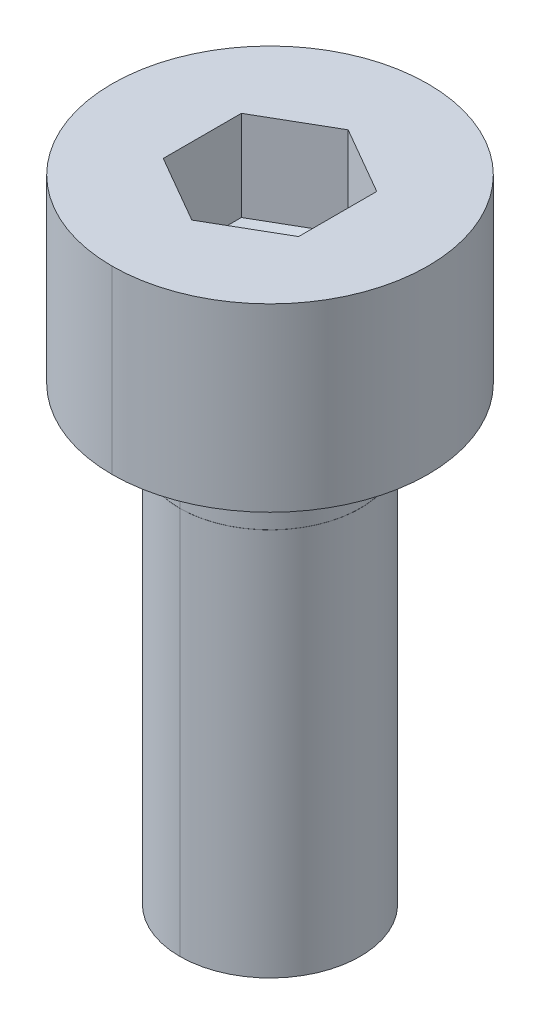
ISO-10303-21;
HEADER;
FILE_DESCRIPTION(('STEP AP214'),'2;1');
FILE_NAME('part.step','',(''),(''),'','','');
FILE_SCHEMA(('AUTOMOTIVE_DESIGN { 1 0 10303 214 1 1 1 1 }'));
ENDSEC;
DATA;
#1=APPLICATION_CONTEXT('core data for automotive mechanical design processes');
#2=APPLICATION_PROTOCOL_DEFINITION('international standard','automotive_design',2000,#1);
#3=PRODUCT_CONTEXT('',#1,'mechanical');
#4=PRODUCT('Part','Part','',(#3));
#5=PRODUCT_RELATED_PRODUCT_CATEGORY('part','',(#4));
#6=PRODUCT_DEFINITION_FORMATION('','',#4);
#7=PRODUCT_DEFINITION_CONTEXT('part definition',#1,'design');
#8=PRODUCT_DEFINITION('design','',#6,#7);
#9=PRODUCT_DEFINITION_SHAPE('','',#8);
#10=(LENGTH_UNIT() NAMED_UNIT(*) SI_UNIT(.MILLI.,.METRE.));
#11=(NAMED_UNIT(*) PLANE_ANGLE_UNIT() SI_UNIT($,.RADIAN.));
#12=(NAMED_UNIT(*) SI_UNIT($,.STERADIAN.) SOLID_ANGLE_UNIT());
#13=UNCERTAINTY_MEASURE_WITH_UNIT(LENGTH_MEASURE(1.E-05),#10,'distance_accuracy_value','');
#14=(GEOMETRIC_REPRESENTATION_CONTEXT(3) GLOBAL_UNCERTAINTY_ASSIGNED_CONTEXT((#13)) GLOBAL_UNIT_ASSIGNED_CONTEXT((#10,
#11,#12)) REPRESENTATION_CONTEXT('',''));
#15=CARTESIAN_POINT('',(0.,0.,0.));
#16=DIRECTION('',(0.,0.,1.));
#17=DIRECTION('',(1.,0.,0.));
#18=AXIS2_PLACEMENT_3D('',#15,#16,#17);
#19=CARTESIAN_POINT('',(-21.75,1133.5,-4.99289208382735E-13));
#20=DIRECTION('',(0.,1.,0.));
#21=DIRECTION('',(0.,0.,-1.));
#22=AXIS2_PLACEMENT_3D('',#19,#20,#21);
#23=CONICAL_SURFACE('',#22,1732.05080756888,1.0471975511966);
#24=DIRECTION('',(0.,0.5,-0.866025403784439));
#25=VECTOR('',#24,1.);
#26=CARTESIAN_POINT('',(-21.75,133.499999999999,-1.1643233849004E-13));
#27=LINE('',#26,#25);
#28=CARTESIAN_POINT('',(-21.75,133.499999999999,-1.1643233849004E-13));
#29=VERTEX_POINT('',#28);
#30=CARTESIAN_POINT('',(-21.75,134.499999999999,-1.732050807569));
#31=VERTEX_POINT('',#30);
#32=EDGE_CURVE('E191',#29,#31,#27,.T.);
#33=ORIENTED_EDGE('',*,*,#32,.F.);
#34=DIRECTION('',(0.,0.5,0.866025403784439));
#35=VECTOR('',#34,1.);
#36=CARTESIAN_POINT('',(-21.75,133.499999999999,-1.1643233849004E-13));
#37=LINE('',#36,#35);
#38=CARTESIAN_POINT('',(-21.75,134.499999999999,1.73205080756877));
#39=VERTEX_POINT('',#38);
#40=EDGE_CURVE('E183',#29,#39,#37,.T.);
#41=ORIENTED_EDGE('',*,*,#40,.T.);
#42=CARTESIAN_POINT('',(-21.75,134.499999999999,-1.1687642769989E-13));
#43=DIRECTION('',(0.,1.,0.));
#44=DIRECTION('',(0.,0.,1.));
#45=AXIS2_PLACEMENT_3D('',#42,#43,#44);
#46=CIRCLE('',#45,1.73205080756888);
#47=CARTESIAN_POINT('',(-20.25,134.499999999999,0.866025403784325));
#48=VERTEX_POINT('',#47);
#49=EDGE_CURVE('E156',#39,#48,#46,.T.);
#50=ORIENTED_EDGE('',*,*,#49,.T.);
#51=CARTESIAN_POINT('',(-21.75,134.499999999999,-1.1687642769989E-13));
#52=DIRECTION('',(0.,1.,0.));
#53=DIRECTION('',(0.,0.,1.));
#54=AXIS2_PLACEMENT_3D('',#51,#52,#53);
#55=CIRCLE('',#54,1.73205080756888);
#56=CARTESIAN_POINT('',(-20.25,134.499999999999,-0.866025403784554));
#57=VERTEX_POINT('',#56);
#58=EDGE_CURVE('E218',#48,#57,#55,.T.);
#59=ORIENTED_EDGE('',*,*,#58,.T.);
#60=CARTESIAN_POINT('',(-21.75,134.499999999999,-1.1687642769989E-13));
#61=DIRECTION('',(0.,1.,0.));
#62=DIRECTION('',(0.,0.,1.));
#63=AXIS2_PLACEMENT_3D('',#60,#61,#62);
#64=CIRCLE('',#63,1.73205080756888);
#65=EDGE_CURVE('E235',#57,#31,#64,.T.);
#66=ORIENTED_EDGE('',*,*,#65,.T.);
#67=EDGE_LOOP('',(#33,#41,#50,#59,#66));
#68=FACE_BOUND('',#67,.T.);
#69=ADVANCED_FACE('F17',(#68),#23,.F.);
#70=CARTESIAN_POINT('',(-21.75,132.499999999999,-1.1598824928019E-13));
#71=DIRECTION('',(0.,-1.,0.));
#72=DIRECTION('',(0.,0.,1.));
#73=AXIS2_PLACEMENT_3D('',#70,#71,#72);
#74=CYLINDRICAL_SURFACE('',#73,3.49999999999984);
#75=CARTESIAN_POINT('',(-21.75,136.499999999999,-1.1776460611959E-13));
#76=DIRECTION('',(0.,1.,0.));
#77=DIRECTION('',(0.,0.,1.));
#78=AXIS2_PLACEMENT_3D('',#75,#76,#77);
#79=CIRCLE('',#78,3.49999999999984);
#80=CARTESIAN_POINT('',(-21.75,136.499999999999,-3.49999999999996));
#81=VERTEX_POINT('',#80);
#82=CARTESIAN_POINT('',(-21.75,136.499999999999,3.49999999999972));
#83=VERTEX_POINT('',#82);
#84=EDGE_CURVE('E11',#81,#83,#79,.T.);
#85=ORIENTED_EDGE('',*,*,#84,.F.);
#86=DIRECTION('',(0.,-1.,0.));
#87=VECTOR('',#86,1.);
#88=CARTESIAN_POINT('',(-21.75,132.499999999999,-3.49999999999995));
#89=LINE('',#88,#87);
#90=CARTESIAN_POINT('',(-21.75,132.499999999999,-3.49999999999995));
#91=VERTEX_POINT('',#90);
#92=EDGE_CURVE('E230',#81,#91,#89,.T.);
#93=ORIENTED_EDGE('',*,*,#92,.T.);
#94=CARTESIAN_POINT('',(-21.75,132.499999999999,-1.1598824928019E-13));
#95=DIRECTION('',(0.,1.,0.));
#96=DIRECTION('',(0.,0.,1.));
#97=AXIS2_PLACEMENT_3D('',#94,#95,#96);
#98=CIRCLE('',#97,3.49999999999984);
#99=CARTESIAN_POINT('',(-21.75,132.499999999999,3.49999999999972));
#100=VERTEX_POINT('',#99);
#101=EDGE_CURVE('E286',#91,#100,#98,.T.);
#102=ORIENTED_EDGE('',*,*,#101,.T.);
#103=DIRECTION('',(0.,-1.,0.));
#104=VECTOR('',#103,1.);
#105=CARTESIAN_POINT('',(-21.75,132.499999999999,3.49999999999972));
#106=LINE('',#105,#104);
#107=EDGE_CURVE('E278',#83,#100,#106,.T.);
#108=ORIENTED_EDGE('',*,*,#107,.F.);
#109=EDGE_LOOP('',(#85,#93,#102,#108));
#110=FACE_BOUND('',#109,.T.);
#111=ADVANCED_FACE('F553',(#110),#74,.T.);
#112=CARTESIAN_POINT('',(-21.75,132.499999999999,-1.1598824928019E-13));
#113=DIRECTION('',(0.,-1.,0.));
#114=DIRECTION('',(0.,0.,1.));
#115=AXIS2_PLACEMENT_3D('',#112,#113,#114);
#116=CYLINDRICAL_SURFACE('',#115,1.99749999999988);
#117=CARTESIAN_POINT('',(-21.75,132.499999999999,-1.1598824928019E-13));
#118=DIRECTION('',(0.,1.,0.));
#119=DIRECTION('',(0.,0.,1.));
#120=AXIS2_PLACEMENT_3D('',#117,#118,#119);
#121=CIRCLE('',#120,1.99749999999988);
#122=CARTESIAN_POINT('',(-21.75,132.499999999999,-1.9975));
#123=VERTEX_POINT('',#122);
#124=CARTESIAN_POINT('',(-21.75,132.499999999999,1.99749999999976));
#125=VERTEX_POINT('',#124);
#126=EDGE_CURVE('E293',#123,#125,#121,.T.);
#127=ORIENTED_EDGE('',*,*,#126,.F.);
#128=DIRECTION('',(0.,-1.,0.));
#129=VECTOR('',#128,1.);
#130=CARTESIAN_POINT('',(-21.75,132.499999999999,-1.9975));
#131=LINE('',#130,#129);
#132=CARTESIAN_POINT('',(-21.75,131.099999999999,-1.9975));
#133=VERTEX_POINT('',#132);
#134=EDGE_CURVE('E249',#123,#133,#131,.T.);
#135=ORIENTED_EDGE('',*,*,#134,.T.);
#136=CARTESIAN_POINT('',(-21.75,131.099999999999,-1.153665243864E-13));
#137=DIRECTION('',(0.,1.,0.));
#138=DIRECTION('',(0.,0.,1.));
#139=AXIS2_PLACEMENT_3D('',#136,#137,#138);
#140=CIRCLE('',#139,1.99749999999988);
#141=CARTESIAN_POINT('',(-21.75,131.099999999999,1.99749999999976));
#142=VERTEX_POINT('',#141);
#143=EDGE_CURVE('E261',#133,#142,#140,.T.);
#144=ORIENTED_EDGE('',*,*,#143,.T.);
#145=DIRECTION('',(0.,-1.,0.));
#146=VECTOR('',#145,1.);
#147=CARTESIAN_POINT('',(-21.75,132.499999999999,1.99749999999976));
#148=LINE('',#147,#146);
#149=EDGE_CURVE('E245',#125,#142,#148,.T.);
#150=ORIENTED_EDGE('',*,*,#149,.F.);
#151=EDGE_LOOP('',(#127,#135,#144,#150));
#152=FACE_BOUND('',#151,.T.);
#153=ADVANCED_FACE('F543',(#152),#116,.T.);
#154=CARTESIAN_POINT('',(-21.75,132.499999999999,-1.1598824928019E-13));
#155=DIRECTION('',(0.,-1.,0.));
#156=DIRECTION('',(0.,0.,1.));
#157=AXIS2_PLACEMENT_3D('',#154,#155,#156);
#158=CYLINDRICAL_SURFACE('',#157,1.99999999999978);
#159=CARTESIAN_POINT('',(-21.75,131.099999999999,-1.153665243864E-13));
#160=DIRECTION('',(0.,1.,0.));
#161=DIRECTION('',(0.,0.,1.));
#162=AXIS2_PLACEMENT_3D('',#159,#160,#161);
#163=CIRCLE('',#162,1.99999999999978);
#164=CARTESIAN_POINT('',(-21.75,131.099999999999,-1.9999999999999));
#165=VERTEX_POINT('',#164);
#166=CARTESIAN_POINT('',(-21.75,131.099999999999,1.99999999999967));
#167=VERTEX_POINT('',#166);
#168=EDGE_CURVE('E222',#165,#167,#163,.T.);
#169=ORIENTED_EDGE('',*,*,#168,.F.);
#170=DIRECTION('',(0.,-1.,0.));
#171=VECTOR('',#170,1.);
#172=CARTESIAN_POINT('',(-21.75,132.499999999999,-1.9999999999999));
#173=LINE('',#172,#171);
#174=CARTESIAN_POINT('',(-21.75,122.499999999999,-1.99999999999989));
#175=VERTEX_POINT('',#174);
#176=EDGE_CURVE('E264',#165,#175,#173,.T.);
#177=ORIENTED_EDGE('',*,*,#176,.T.);
#178=CARTESIAN_POINT('',(-21.75,122.499999999999,-1.11547357181689E-13));
#179=DIRECTION('',(0.,1.,0.));
#180=DIRECTION('',(0.,0.,1.));
#181=AXIS2_PLACEMENT_3D('',#178,#179,#180);
#182=CIRCLE('',#181,1.99999999999978);
#183=CARTESIAN_POINT('',(-21.75,122.499999999999,1.99999999999967));
#184=VERTEX_POINT('',#183);
#185=EDGE_CURVE('E25',#175,#184,#182,.T.);
#186=ORIENTED_EDGE('',*,*,#185,.T.);
#187=DIRECTION('',(0.,-1.,0.));
#188=VECTOR('',#187,1.);
#189=CARTESIAN_POINT('',(-21.75,132.499999999999,1.99999999999967));
#190=LINE('',#189,#188);
#191=EDGE_CURVE('E308',#167,#184,#190,.T.);
#192=ORIENTED_EDGE('',*,*,#191,.F.);
#193=EDGE_LOOP('',(#169,#177,#186,#192));
#194=FACE_BOUND('',#193,.T.);
#195=ADVANCED_FACE('F532',(#194),#158,.T.);
#196=CARTESIAN_POINT('',(-18.25,136.499999999999,-1.17449378820726E-13));
#197=DIRECTION('',(0.,1.,0.));
#198=DIRECTION('',(0.,0.,-1.));
#199=AXIS2_PLACEMENT_3D('',#196,#197,#198);
#200=PLANE('',#199);
#201=DIRECTION('',(-0.866025403784439,0.,-0.5));
#202=VECTOR('',#201,1.);
#203=CARTESIAN_POINT('',(-21.75,136.499999999999,1.73205080756876));
#204=LINE('',#203,#202);
#205=CARTESIAN_POINT('',(-21.75,136.499999999999,1.73205080756876));
#206=VERTEX_POINT('',#205);
#207=CARTESIAN_POINT('',(-23.25,136.499999999999,0.86602540378432));
#208=VERTEX_POINT('',#207);
#209=EDGE_CURVE('E147',#206,#208,#204,.T.);
#210=ORIENTED_EDGE('',*,*,#209,.T.);
#211=DIRECTION('',(0.,0.,-1.));
#212=VECTOR('',#211,1.);
#213=CARTESIAN_POINT('',(-23.25,136.499999999999,0.86602540378432));
#214=LINE('',#213,#212);
#215=CARTESIAN_POINT('',(-23.25,136.499999999999,-0.866025403784556));
#216=VERTEX_POINT('',#215);
#217=EDGE_CURVE('E267',#208,#216,#214,.T.);
#218=ORIENTED_EDGE('',*,*,#217,.T.);
#219=DIRECTION('',(0.866025403784439,0.,-0.5));
#220=VECTOR('',#219,1.);
#221=CARTESIAN_POINT('',(-23.25,136.499999999999,-0.866025403784556));
#222=LINE('',#221,#220);
#223=CARTESIAN_POINT('',(-21.75,136.499999999999,-1.73205080756899));
#224=VERTEX_POINT('',#223);
#225=EDGE_CURVE('E257',#216,#224,#222,.T.);
#226=ORIENTED_EDGE('',*,*,#225,.T.);
#227=DIRECTION('',(0.866025403784439,0.,0.5));
#228=VECTOR('',#227,1.);
#229=CARTESIAN_POINT('',(-21.75,136.499999999999,-1.73205080756899));
#230=LINE('',#229,#228);
#231=CARTESIAN_POINT('',(-20.25,136.499999999999,-0.866025403784555));
#232=VERTEX_POINT('',#231);
#233=EDGE_CURVE('E203',#224,#232,#230,.T.);
#234=ORIENTED_EDGE('',*,*,#233,.T.);
#235=DIRECTION('',(0.,0.,1.));
#236=VECTOR('',#235,1.);
#237=CARTESIAN_POINT('',(-20.25,136.499999999999,-0.866025403784555));
#238=LINE('',#237,#236);
#239=CARTESIAN_POINT('',(-20.25,136.499999999999,0.86602540378432));
#240=VERTEX_POINT('',#239);
#241=EDGE_CURVE('E207',#232,#240,#238,.T.);
#242=ORIENTED_EDGE('',*,*,#241,.T.);
#243=DIRECTION('',(-0.866025403784439,0.,0.5));
#244=VECTOR('',#243,1.);
#245=CARTESIAN_POINT('',(-20.25,136.499999999999,0.86602540378432));
#246=LINE('',#245,#244);
#247=EDGE_CURVE('E151',#240,#206,#246,.T.);
#248=ORIENTED_EDGE('',*,*,#247,.T.);
#249=EDGE_LOOP('',(#210,#218,#226,#234,#242,#248));
#250=FACE_BOUND('',#249,.T.);
#251=CARTESIAN_POINT('',(-21.75,136.499999999999,-1.1776460611959E-13));
#252=DIRECTION('',(0.,1.,0.));
#253=DIRECTION('',(0.,0.,1.));
#254=AXIS2_PLACEMENT_3D('',#251,#252,#253);
#255=CIRCLE('',#254,3.49999999999984);
#256=EDGE_CURVE('E234',#83,#81,#255,.T.);
#257=ORIENTED_EDGE('',*,*,#256,.T.);
#258=ORIENTED_EDGE('',*,*,#84,.T.);
#259=EDGE_LOOP('',(#257,#258));
#260=FACE_BOUND('',#259,.T.);
#261=ADVANCED_FACE('F522',(#250,#260),#200,.T.);
#262=CARTESIAN_POINT('',(-21.75,122.499999999999,-1.11547357181689E-13));
#263=DIRECTION('',(0.,-1.,0.));
#264=DIRECTION('',(-1.,0.,0.));
#265=AXIS2_PLACEMENT_3D('',#262,#263,#264);
#266=PLANE('',#265);
#267=CARTESIAN_POINT('',(-21.75,122.499999999999,-1.11547357181689E-13));
#268=DIRECTION('',(0.,1.,0.));
#269=DIRECTION('',(0.,0.,1.));
#270=AXIS2_PLACEMENT_3D('',#267,#268,#269);
#271=CIRCLE('',#270,1.99999999999978);
#272=EDGE_CURVE('E312',#184,#175,#271,.T.);
#273=ORIENTED_EDGE('',*,*,#272,.F.);
#274=ORIENTED_EDGE('',*,*,#185,.F.);
#275=EDGE_LOOP('',(#273,#274));
#276=FACE_BOUND('',#275,.T.);
#277=ADVANCED_FACE('F511',(#276),#266,.T.);
#278=CARTESIAN_POINT('',(-21.75,132.499999999999,-1.1598824928019E-13));
#279=DIRECTION('',(0.,-1.,0.));
#280=DIRECTION('',(0.,0.,1.));
#281=AXIS2_PLACEMENT_3D('',#278,#279,#280);
#282=CYLINDRICAL_SURFACE('',#281,1.99999999999978);
#283=ORIENTED_EDGE('',*,*,#176,.F.);
#284=CARTESIAN_POINT('',(-21.75,131.099999999999,-1.153665243864E-13));
#285=DIRECTION('',(0.,1.,0.));
#286=DIRECTION('',(0.,0.,1.));
#287=AXIS2_PLACEMENT_3D('',#284,#285,#286);
#288=CIRCLE('',#287,1.99999999999978);
#289=EDGE_CURVE('E219',#167,#165,#288,.T.);
#290=ORIENTED_EDGE('',*,*,#289,.F.);
#291=ORIENTED_EDGE('',*,*,#191,.T.);
#292=ORIENTED_EDGE('',*,*,#272,.T.);
#293=EDGE_LOOP('',(#283,#290,#291,#292));
#294=FACE_BOUND('',#293,.T.);
#295=ADVANCED_FACE('F500',(#294),#282,.T.);
#296=CARTESIAN_POINT('',(-19.7500000000003,131.099999999999,-1.15186394501335E-13));
#297=DIRECTION('',(0.,1.,0.));
#298=DIRECTION('',(0.,0.,-1.));
#299=AXIS2_PLACEMENT_3D('',#296,#297,#298);
#300=PLANE('',#299);
#301=CARTESIAN_POINT('',(-21.75,131.099999999999,-1.153665243864E-13));
#302=DIRECTION('',(0.,1.,0.));
#303=DIRECTION('',(0.,0.,1.));
#304=AXIS2_PLACEMENT_3D('',#301,#302,#303);
#305=CIRCLE('',#304,1.99749999999988);
#306=EDGE_CURVE('E223',#142,#133,#305,.T.);
#307=ORIENTED_EDGE('',*,*,#306,.F.);
#308=ORIENTED_EDGE('',*,*,#143,.F.);
#309=EDGE_LOOP('',(#307,#308));
#310=FACE_BOUND('',#309,.T.);
#311=ORIENTED_EDGE('',*,*,#289,.T.);
#312=ORIENTED_EDGE('',*,*,#168,.T.);
#313=EDGE_LOOP('',(#311,#312));
#314=FACE_BOUND('',#313,.T.);
#315=ADVANCED_FACE('F489',(#310,#314),#300,.T.);
#316=CARTESIAN_POINT('',(-21.75,132.499999999999,-1.1598824928019E-13));
#317=DIRECTION('',(0.,-1.,0.));
#318=DIRECTION('',(0.,0.,1.));
#319=AXIS2_PLACEMENT_3D('',#316,#317,#318);
#320=CYLINDRICAL_SURFACE('',#319,1.99749999999988);
#321=ORIENTED_EDGE('',*,*,#134,.F.);
#322=CARTESIAN_POINT('',(-21.75,132.499999999999,-1.1598824928019E-13));
#323=DIRECTION('',(0.,1.,0.));
#324=DIRECTION('',(0.,0.,1.));
#325=AXIS2_PLACEMENT_3D('',#322,#323,#324);
#326=CIRCLE('',#325,1.99749999999988);
#327=EDGE_CURVE('E289',#125,#123,#326,.T.);
#328=ORIENTED_EDGE('',*,*,#327,.F.);
#329=ORIENTED_EDGE('',*,*,#149,.T.);
#330=ORIENTED_EDGE('',*,*,#306,.T.);
#331=EDGE_LOOP('',(#321,#328,#329,#330));
#332=FACE_BOUND('',#331,.T.);
#333=ADVANCED_FACE('F478',(#332),#320,.T.);
#334=CARTESIAN_POINT('',(-21.75,132.499999999999,-1.1598824928019E-13));
#335=DIRECTION('',(0.,-1.,0.));
#336=DIRECTION('',(-1.,0.,0.));
#337=AXIS2_PLACEMENT_3D('',#334,#335,#336);
#338=PLANE('',#337);
#339=ORIENTED_EDGE('',*,*,#327,.T.);
#340=ORIENTED_EDGE('',*,*,#126,.T.);
#341=EDGE_LOOP('',(#339,#340));
#342=FACE_BOUND('',#341,.T.);
#343=CARTESIAN_POINT('',(-21.75,132.499999999999,-1.1598824928019E-13));
#344=DIRECTION('',(0.,1.,0.));
#345=DIRECTION('',(0.,0.,1.));
#346=AXIS2_PLACEMENT_3D('',#343,#344,#345);
#347=CIRCLE('',#346,3.49999999999984);
#348=EDGE_CURVE('E282',#100,#91,#347,.T.);
#349=ORIENTED_EDGE('',*,*,#348,.F.);
#350=ORIENTED_EDGE('',*,*,#101,.F.);
#351=EDGE_LOOP('',(#349,#350));
#352=FACE_BOUND('',#351,.T.);
#353=ADVANCED_FACE('F409',(#342,#352),#338,.T.);
#354=CARTESIAN_POINT('',(-21.75,132.499999999999,-1.1598824928019E-13));
#355=DIRECTION('',(0.,-1.,0.));
#356=DIRECTION('',(0.,0.,1.));
#357=AXIS2_PLACEMENT_3D('',#354,#355,#356);
#358=CYLINDRICAL_SURFACE('',#357,3.49999999999984);
#359=ORIENTED_EDGE('',*,*,#92,.F.);
#360=ORIENTED_EDGE('',*,*,#256,.F.);
#361=ORIENTED_EDGE('',*,*,#107,.T.);
#362=ORIENTED_EDGE('',*,*,#348,.T.);
#363=EDGE_LOOP('',(#359,#360,#361,#362));
#364=FACE_BOUND('',#363,.T.);
#365=ADVANCED_FACE('F405',(#364),#358,.T.);
#366=CARTESIAN_POINT('',(-20.25,136.499999999999,0.86602540378432));
#367=DIRECTION('',(-0.5,0.,-0.866025403784439));
#368=DIRECTION('',(-0.866025403784439,0.,0.5));
#369=AXIS2_PLACEMENT_3D('',#366,#367,#368);
#370=PLANE('',#369);
#371=DIRECTION('',(-0.866025403784439,0.,0.5));
#372=VECTOR('',#371,1.);
#373=CARTESIAN_POINT('',(-20.25,134.499999999999,0.866025403784321));
#374=LINE('',#373,#372);
#375=EDGE_CURVE('E158',#48,#39,#374,.T.);
#376=ORIENTED_EDGE('',*,*,#375,.T.);
#377=DIRECTION('',(0.,-1.,0.));
#378=VECTOR('',#377,1.);
#379=CARTESIAN_POINT('',(-21.75,136.499999999999,1.73205080756876));
#380=LINE('',#379,#378);
#381=EDGE_CURVE('E140',#206,#39,#380,.T.);
#382=ORIENTED_EDGE('',*,*,#381,.F.);
#383=ORIENTED_EDGE('',*,*,#247,.F.);
#384=DIRECTION('',(0.,-1.,0.));
#385=VECTOR('',#384,1.);
#386=CARTESIAN_POINT('',(-20.25,136.499999999999,0.86602540378432));
#387=LINE('',#386,#385);
#388=EDGE_CURVE('E164',#240,#48,#387,.T.);
#389=ORIENTED_EDGE('',*,*,#388,.T.);
#390=EDGE_LOOP('',(#376,#382,#383,#389));
#391=FACE_BOUND('',#390,.T.);
#392=ADVANCED_FACE('F166',(#391),#370,.T.);
#393=CARTESIAN_POINT('',(-21.75,136.499999999999,1.73205080756876));
#394=DIRECTION('',(0.5,0.,-0.866025403784439));
#395=DIRECTION('',(0.,-1.,0.));
#396=AXIS2_PLACEMENT_3D('',#393,#394,#395);
#397=PLANE('',#396);
#398=DIRECTION('',(-0.866025403784439,0.,-0.5));
#399=VECTOR('',#398,1.);
#400=CARTESIAN_POINT('',(-21.75,134.499999999999,1.73205080756876));
#401=LINE('',#400,#399);
#402=CARTESIAN_POINT('',(-23.25,134.499999999999,0.866025403784325));
#403=VERTEX_POINT('',#402);
#404=EDGE_CURVE('E145',#39,#403,#401,.T.);
#405=ORIENTED_EDGE('',*,*,#404,.T.);
#406=DIRECTION('',(0.,-1.,0.));
#407=VECTOR('',#406,1.);
#408=CARTESIAN_POINT('',(-23.25,136.499999999999,0.86602540378432));
#409=LINE('',#408,#407);
#410=EDGE_CURVE('E270',#208,#403,#409,.T.);
#411=ORIENTED_EDGE('',*,*,#410,.F.);
#412=ORIENTED_EDGE('',*,*,#209,.F.);
#413=ORIENTED_EDGE('',*,*,#381,.T.);
#414=EDGE_LOOP('',(#405,#411,#412,#413));
#415=FACE_BOUND('',#414,.T.);
#416=ADVANCED_FACE('F142',(#415),#397,.T.);
#417=CARTESIAN_POINT('',(-23.25,136.499999999999,0.86602540378432));
#418=DIRECTION('',(1.,0.,0.));
#419=DIRECTION('',(0.,0.,1.));
#420=AXIS2_PLACEMENT_3D('',#417,#418,#419);
#421=PLANE('',#420);
#422=DIRECTION('',(0.,0.,-1.));
#423=VECTOR('',#422,1.);
#424=CARTESIAN_POINT('',(-23.25,134.499999999999,0.866025403784321));
#425=LINE('',#424,#423);
#426=CARTESIAN_POINT('',(-23.25,134.499999999999,-0.866025403784572));
#427=VERTEX_POINT('',#426);
#428=EDGE_CURVE('E177',#403,#427,#425,.T.);
#429=ORIENTED_EDGE('',*,*,#428,.T.);
#430=DIRECTION('',(0.,-1.,0.));
#431=VECTOR('',#430,1.);
#432=CARTESIAN_POINT('',(-23.25,136.499999999999,-0.866025403784556));
#433=LINE('',#432,#431);
#434=EDGE_CURVE('E260',#216,#427,#433,.T.);
#435=ORIENTED_EDGE('',*,*,#434,.F.);
#436=ORIENTED_EDGE('',*,*,#217,.F.);
#437=ORIENTED_EDGE('',*,*,#410,.T.);
#438=EDGE_LOOP('',(#429,#435,#436,#437));
#439=FACE_BOUND('',#438,.T.);
#440=ADVANCED_FACE('F376',(#439),#421,.T.);
#441=CARTESIAN_POINT('',(-23.25,136.499999999999,-0.866025403784556));
#442=DIRECTION('',(0.5,0.,0.866025403784439));
#443=DIRECTION('',(0.,-1.,0.));
#444=AXIS2_PLACEMENT_3D('',#441,#442,#443);
#445=PLANE('',#444);
#446=DIRECTION('',(0.866025403784439,0.,-0.5));
#447=VECTOR('',#446,1.);
#448=CARTESIAN_POINT('',(-23.25,134.499999999999,-0.866025403784555));
#449=LINE('',#448,#447);
#450=EDGE_CURVE('E238',#427,#31,#449,.T.);
#451=ORIENTED_EDGE('',*,*,#450,.T.);
#452=DIRECTION('',(0.,-1.,0.));
#453=VECTOR('',#452,1.);
#454=CARTESIAN_POINT('',(-21.75,136.499999999999,-1.73205080756899));
#455=LINE('',#454,#453);
#456=EDGE_CURVE('E201',#224,#31,#455,.T.);
#457=ORIENTED_EDGE('',*,*,#456,.F.);
#458=ORIENTED_EDGE('',*,*,#225,.F.);
#459=ORIENTED_EDGE('',*,*,#434,.T.);
#460=EDGE_LOOP('',(#451,#457,#458,#459));
#461=FACE_BOUND('',#460,.T.);
#462=ADVANCED_FACE('F345',(#461),#445,.T.);
#463=CARTESIAN_POINT('',(-21.75,136.499999999999,-1.73205080756899));
#464=DIRECTION('',(-0.5,0.,0.866025403784439));
#465=DIRECTION('',(0.,1.,0.));
#466=AXIS2_PLACEMENT_3D('',#463,#464,#465);
#467=PLANE('',#466);
#468=DIRECTION('',(0.866025403784439,0.,0.5));
#469=VECTOR('',#468,1.);
#470=CARTESIAN_POINT('',(-21.75,134.499999999999,-1.73205080756899));
#471=LINE('',#470,#469);
#472=EDGE_CURVE('E227',#31,#57,#471,.T.);
#473=ORIENTED_EDGE('',*,*,#472,.T.);
#474=DIRECTION('',(0.,-1.,0.));
#475=VECTOR('',#474,1.);
#476=CARTESIAN_POINT('',(-20.25,136.499999999999,-0.866025403784555));
#477=LINE('',#476,#475);
#478=EDGE_CURVE('E206',#232,#57,#477,.T.);
#479=ORIENTED_EDGE('',*,*,#478,.F.);
#480=ORIENTED_EDGE('',*,*,#233,.F.);
#481=ORIENTED_EDGE('',*,*,#456,.T.);
#482=EDGE_LOOP('',(#473,#479,#480,#481));
#483=FACE_BOUND('',#482,.T.);
#484=ADVANCED_FACE('F340',(#483),#467,.T.);
#485=CARTESIAN_POINT('',(-20.25,136.499999999999,-0.866025403784555));
#486=DIRECTION('',(-1.,0.,0.));
#487=DIRECTION('',(0.,0.,1.));
#488=AXIS2_PLACEMENT_3D('',#485,#486,#487);
#489=PLANE('',#488);
#490=DIRECTION('',(0.,0.,1.));
#491=VECTOR('',#490,1.);
#492=CARTESIAN_POINT('',(-20.25,134.499999999999,-0.866025403784554));
#493=LINE('',#492,#491);
#494=EDGE_CURVE('E188',#57,#48,#493,.T.);
#495=ORIENTED_EDGE('',*,*,#494,.T.);
#496=ORIENTED_EDGE('',*,*,#388,.F.);
#497=ORIENTED_EDGE('',*,*,#241,.F.);
#498=ORIENTED_EDGE('',*,*,#478,.T.);
#499=EDGE_LOOP('',(#495,#496,#497,#498));
#500=FACE_BOUND('',#499,.T.);
#501=ADVANCED_FACE('F344',(#500),#489,.T.);
#502=CARTESIAN_POINT('',(-20.0179491924311,134.499999999999,-1.16720430643443E-13));
#503=DIRECTION('',(0.,1.,0.));
#504=DIRECTION('',(0.,0.,-1.));
#505=AXIS2_PLACEMENT_3D('',#502,#503,#504);
#506=PLANE('',#505);
#507=ORIENTED_EDGE('',*,*,#375,.F.);
#508=ORIENTED_EDGE('',*,*,#49,.F.);
#509=EDGE_LOOP('',(#507,#508));
#510=FACE_BOUND('',#509,.T.);
#511=ADVANCED_FACE('F157',(#510),#506,.F.);
#512=CARTESIAN_POINT('',(-20.0179491924311,134.499999999999,-1.16720430643443E-13));
#513=DIRECTION('',(0.,1.,0.));
#514=DIRECTION('',(0.,0.,-1.));
#515=AXIS2_PLACEMENT_3D('',#512,#513,#514);
#516=PLANE('',#515);
#517=ORIENTED_EDGE('',*,*,#404,.F.);
#518=CARTESIAN_POINT('',(-21.75,134.499999999999,-1.1687642769989E-13));
#519=DIRECTION('',(0.,1.,0.));
#520=DIRECTION('',(0.,0.,1.));
#521=AXIS2_PLACEMENT_3D('',#518,#519,#520);
#522=CIRCLE('',#521,1.73205080756888);
#523=EDGE_CURVE('E174',#403,#39,#522,.T.);
#524=ORIENTED_EDGE('',*,*,#523,.F.);
#525=EDGE_LOOP('',(#517,#524));
#526=FACE_BOUND('',#525,.T.);
#527=ADVANCED_FACE('F173',(#526),#516,.F.);
#528=CARTESIAN_POINT('',(-20.0179491924311,134.499999999999,-1.16720430643443E-13));
#529=DIRECTION('',(0.,1.,0.));
#530=DIRECTION('',(0.,0.,-1.));
#531=AXIS2_PLACEMENT_3D('',#528,#529,#530);
#532=PLANE('',#531);
#533=ORIENTED_EDGE('',*,*,#428,.F.);
#534=CARTESIAN_POINT('',(-21.75,134.499999999999,-1.1687642769989E-13));
#535=DIRECTION('',(0.,1.,0.));
#536=DIRECTION('',(0.,0.,1.));
#537=AXIS2_PLACEMENT_3D('',#534,#535,#536);
#538=CIRCLE('',#537,1.73205080756888);
#539=EDGE_CURVE('E186',#427,#403,#538,.T.);
#540=ORIENTED_EDGE('',*,*,#539,.F.);
#541=EDGE_LOOP('',(#533,#540));
#542=FACE_BOUND('',#541,.T.);
#543=ADVANCED_FACE('F397',(#542),#532,.F.);
#544=CARTESIAN_POINT('',(-20.0179491924311,134.499999999999,-1.16720430643443E-13));
#545=DIRECTION('',(0.,1.,0.));
#546=DIRECTION('',(0.,0.,-1.));
#547=AXIS2_PLACEMENT_3D('',#544,#545,#546);
#548=PLANE('',#547);
#549=ORIENTED_EDGE('',*,*,#450,.F.);
#550=CARTESIAN_POINT('',(-21.75,134.499999999999,-1.1687642769989E-13));
#551=DIRECTION('',(0.,1.,0.));
#552=DIRECTION('',(0.,0.,1.));
#553=AXIS2_PLACEMENT_3D('',#550,#551,#552);
#554=CIRCLE('',#553,1.73205080756888);
#555=EDGE_CURVE('E198',#31,#427,#554,.T.);
#556=ORIENTED_EDGE('',*,*,#555,.F.);
#557=EDGE_LOOP('',(#549,#556));
#558=FACE_BOUND('',#557,.T.);
#559=ADVANCED_FACE('F386',(#558),#548,.F.);
#560=CARTESIAN_POINT('',(-20.0179491924311,134.499999999999,-1.16720430643443E-13));
#561=DIRECTION('',(0.,1.,0.));
#562=DIRECTION('',(0.,0.,-1.));
#563=AXIS2_PLACEMENT_3D('',#560,#561,#562);
#564=PLANE('',#563);
#565=ORIENTED_EDGE('',*,*,#472,.F.);
#566=ORIENTED_EDGE('',*,*,#65,.F.);
#567=EDGE_LOOP('',(#565,#566));
#568=FACE_BOUND('',#567,.T.);
#569=ADVANCED_FACE('F365',(#568),#564,.F.);
#570=CARTESIAN_POINT('',(-20.0179491924311,134.499999999999,-1.16720430643443E-13));
#571=DIRECTION('',(0.,1.,0.));
#572=DIRECTION('',(0.,0.,-1.));
#573=AXIS2_PLACEMENT_3D('',#570,#571,#572);
#574=PLANE('',#573);
#575=ORIENTED_EDGE('',*,*,#494,.F.);
#576=ORIENTED_EDGE('',*,*,#58,.F.);
#577=EDGE_LOOP('',(#575,#576));
#578=FACE_BOUND('',#577,.T.);
#579=ADVANCED_FACE('F332',(#578),#574,.F.);
#580=CARTESIAN_POINT('',(-21.75,1133.5,-4.99289208382735E-13));
#581=DIRECTION('',(0.,1.,0.));
#582=DIRECTION('',(0.,0.,-1.));
#583=AXIS2_PLACEMENT_3D('',#580,#581,#582);
#584=CONICAL_SURFACE('',#583,1732.05080756888,1.0471975511966);
#585=ORIENTED_EDGE('',*,*,#40,.F.);
#586=ORIENTED_EDGE('',*,*,#32,.T.);
#587=ORIENTED_EDGE('',*,*,#555,.T.);
#588=ORIENTED_EDGE('',*,*,#539,.T.);
#589=ORIENTED_EDGE('',*,*,#523,.T.);
#590=EDGE_LOOP('',(#585,#586,#587,#588,#589));
#591=FACE_BOUND('',#590,.T.);
#592=ADVANCED_FACE('F181',(#591),#584,.F.);
#593=CLOSED_SHELL('',(#69,#111,#153,#195,#261,#277,#295,#315,#333,#353,#365,#392,#416,#440,#462,
#484,#501,#511,#527,#543,#559,#569,#579,#592));
#594=MANIFOLD_SOLID_BREP('B1',#593);
#595=ADVANCED_BREP_SHAPE_REPRESENTATION('',(#18,#594),#14);
#596=SHAPE_DEFINITION_REPRESENTATION(#9,#595);
ENDSEC;
END-ISO-10303-21;
